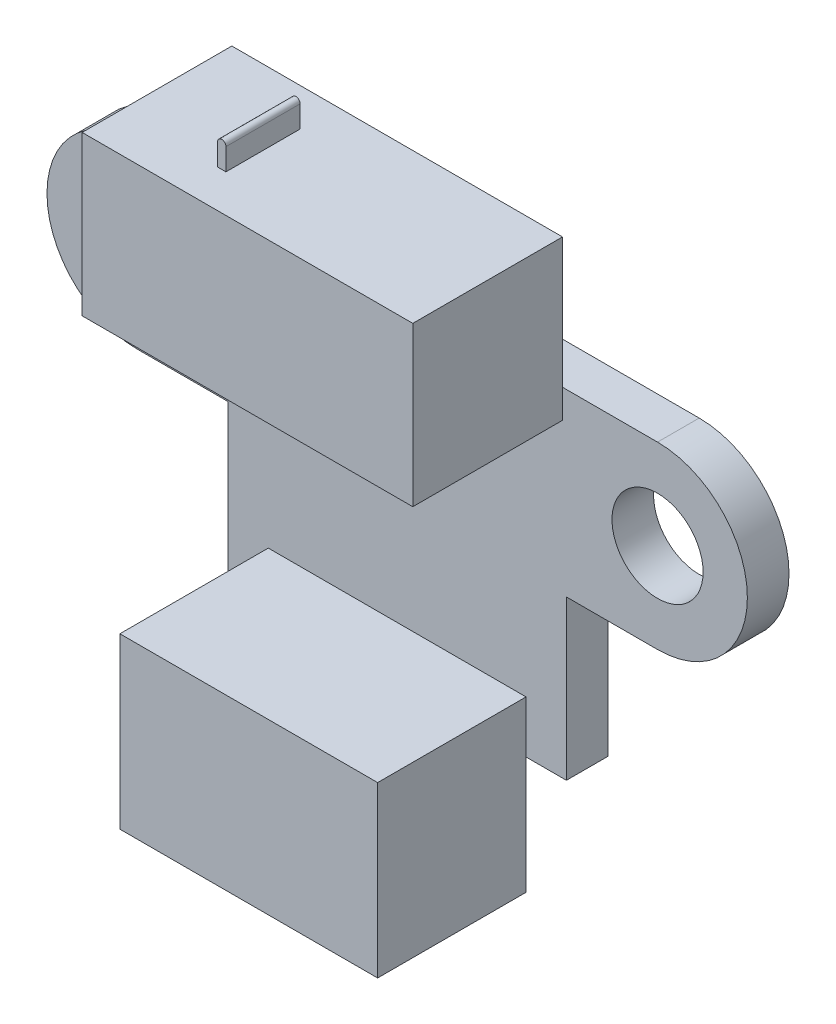
ISO-10303-21;
HEADER;
FILE_DESCRIPTION(('STEP AP214'),'2;1');
FILE_NAME('part.step','',(''),(''),'','','');
FILE_SCHEMA(('AUTOMOTIVE_DESIGN { 1 0 10303 214 1 1 1 1 }'));
ENDSEC;
DATA;
#1=APPLICATION_CONTEXT('core data for automotive mechanical design processes');
#2=APPLICATION_PROTOCOL_DEFINITION('international standard','automotive_design',2000,#1);
#3=PRODUCT_CONTEXT('',#1,'mechanical');
#4=PRODUCT('Part','Part','',(#3));
#5=PRODUCT_RELATED_PRODUCT_CATEGORY('part','',(#4));
#6=PRODUCT_DEFINITION_FORMATION('','',#4);
#7=PRODUCT_DEFINITION_CONTEXT('part definition',#1,'design');
#8=PRODUCT_DEFINITION('design','',#6,#7);
#9=PRODUCT_DEFINITION_SHAPE('','',#8);
#10=(LENGTH_UNIT() NAMED_UNIT(*) SI_UNIT(.MILLI.,.METRE.));
#11=(NAMED_UNIT(*) PLANE_ANGLE_UNIT() SI_UNIT($,.RADIAN.));
#12=(NAMED_UNIT(*) SI_UNIT($,.STERADIAN.) SOLID_ANGLE_UNIT());
#13=UNCERTAINTY_MEASURE_WITH_UNIT(LENGTH_MEASURE(1.E-05),#10,'distance_accuracy_value','');
#14=(GEOMETRIC_REPRESENTATION_CONTEXT(3) GLOBAL_UNCERTAINTY_ASSIGNED_CONTEXT((#13)) GLOBAL_UNIT_ASSIGNED_CONTEXT((#10,
#11,#12)) REPRESENTATION_CONTEXT('',''));
#15=CARTESIAN_POINT('',(0.,0.,0.));
#16=DIRECTION('',(0.,0.,1.));
#17=DIRECTION('',(1.,0.,0.));
#18=AXIS2_PLACEMENT_3D('',#15,#16,#17);
#19=CARTESIAN_POINT('',(-3.5,-3.45,1.6));
#20=DIRECTION('',(0.,0.,1.));
#21=DIRECTION('',(1.,0.,0.));
#22=AXIS2_PLACEMENT_3D('',#19,#20,#21);
#23=PLANE('',#22);
#24=CARTESIAN_POINT('',(-3.5,-3.45,1.6));
#25=DIRECTION('',(0.,0.,1.));
#26=DIRECTION('',(1.,0.,0.));
#27=AXIS2_PLACEMENT_3D('',#24,#25,#26);
#28=CIRCLE('',#27,1.75);
#29=CARTESIAN_POINT('',(-1.75,-3.45,1.6));
#30=VERTEX_POINT('',#29);
#31=EDGE_CURVE('E275',#30,#30,#28,.T.);
#32=ORIENTED_EDGE('',*,*,#31,.F.);
#33=EDGE_LOOP('',(#32));
#34=FACE_BOUND('',#33,.T.);
#35=CARTESIAN_POINT('',(16.5,-3.45,1.6));
#36=DIRECTION('',(0.,0.,1.));
#37=DIRECTION('',(1.,0.,0.));
#38=AXIS2_PLACEMENT_3D('',#35,#36,#37);
#39=CIRCLE('',#38,1.75);
#40=CARTESIAN_POINT('',(18.25,-3.45,1.6));
#41=VERTEX_POINT('',#40);
#42=EDGE_CURVE('E274',#41,#41,#39,.T.);
#43=ORIENTED_EDGE('',*,*,#42,.F.);
#44=EDGE_LOOP('',(#43));
#45=FACE_BOUND('',#44,.T.);
#46=DIRECTION('',(1.,0.,0.));
#47=VECTOR('',#46,1.);
#48=CARTESIAN_POINT('',(0.150000000000001,-1.1,1.6));
#49=LINE('',#48,#47);
#50=CARTESIAN_POINT('',(0.150000000000001,-1.1,1.6));
#51=VERTEX_POINT('',#50);
#52=CARTESIAN_POINT('',(12.85,-1.1,1.6));
#53=VERTEX_POINT('',#52);
#54=EDGE_CURVE('E262',#51,#53,#49,.T.);
#55=ORIENTED_EDGE('',*,*,#54,.F.);
#56=DIRECTION('',(0.,1.,0.));
#57=VECTOR('',#56,1.);
#58=CARTESIAN_POINT('',(0.150000000000001,-3.45,1.6));
#59=LINE('',#58,#57);
#60=CARTESIAN_POINT('',(0.150000000000001,0.,1.6));
#61=VERTEX_POINT('',#60);
#62=EDGE_CURVE('E415',#51,#61,#59,.T.);
#63=ORIENTED_EDGE('',*,*,#62,.T.);
#64=DIRECTION('',(-1.,0.,0.));
#65=VECTOR('',#64,1.);
#66=CARTESIAN_POINT('',(0.,0.,1.6));
#67=LINE('',#66,#65);
#68=CARTESIAN_POINT('',(-3.5,0.,1.6));
#69=VERTEX_POINT('',#68);
#70=EDGE_CURVE('E354',#61,#69,#67,.T.);
#71=ORIENTED_EDGE('',*,*,#70,.T.);
#72=CARTESIAN_POINT('',(-3.5,-3.45,1.6));
#73=DIRECTION('',(0.,0.,1.));
#74=DIRECTION('',(1.,0.,0.));
#75=AXIS2_PLACEMENT_3D('',#72,#73,#74);
#76=CIRCLE('',#75,3.45);
#77=CARTESIAN_POINT('',(-3.5,-6.9,1.6));
#78=VERTEX_POINT('',#77);
#79=EDGE_CURVE('E352',#69,#78,#76,.T.);
#80=ORIENTED_EDGE('',*,*,#79,.T.);
#81=DIRECTION('',(1.,0.,0.));
#82=VECTOR('',#81,1.);
#83=CARTESIAN_POINT('',(-3.5,-6.9,1.6));
#84=LINE('',#83,#82);
#85=CARTESIAN_POINT('',(0.,-6.9,1.6));
#86=VERTEX_POINT('',#85);
#87=EDGE_CURVE('E356',#78,#86,#84,.T.);
#88=ORIENTED_EDGE('',*,*,#87,.T.);
#89=DIRECTION('',(0.,-1.,0.));
#90=VECTOR('',#89,1.);
#91=CARTESIAN_POINT('',(0.,-6.9,1.6));
#92=LINE('',#91,#90);
#93=CARTESIAN_POINT('',(0.,-13.,1.6));
#94=VERTEX_POINT('',#93);
#95=EDGE_CURVE('E358',#86,#94,#92,.T.);
#96=ORIENTED_EDGE('',*,*,#95,.T.);
#97=DIRECTION('',(1.,0.,0.));
#98=VECTOR('',#97,1.);
#99=CARTESIAN_POINT('',(0.,-13.,1.6));
#100=LINE('',#99,#98);
#101=CARTESIAN_POINT('',(1.55,-13.,1.6));
#102=VERTEX_POINT('',#101);
#103=EDGE_CURVE('E361',#94,#102,#100,.T.);
#104=ORIENTED_EDGE('',*,*,#103,.T.);
#105=DIRECTION('',(0.,-1.,0.));
#106=VECTOR('',#105,1.);
#107=CARTESIAN_POINT('',(1.55,-11.,1.6));
#108=LINE('',#107,#106);
#109=CARTESIAN_POINT('',(1.55,-11.,1.6));
#110=VERTEX_POINT('',#109);
#111=EDGE_CURVE('E329',#110,#102,#108,.T.);
#112=ORIENTED_EDGE('',*,*,#111,.F.);
#113=DIRECTION('',(-1.,0.,0.));
#114=VECTOR('',#113,1.);
#115=CARTESIAN_POINT('',(11.45,-11.,1.6));
#116=LINE('',#115,#114);
#117=CARTESIAN_POINT('',(11.45,-11.,1.6));
#118=VERTEX_POINT('',#117);
#119=EDGE_CURVE('E308',#118,#110,#116,.T.);
#120=ORIENTED_EDGE('',*,*,#119,.F.);
#121=DIRECTION('',(0.,1.,0.));
#122=VECTOR('',#121,1.);
#123=CARTESIAN_POINT('',(11.45,-17.5,1.6));
#124=LINE('',#123,#122);
#125=CARTESIAN_POINT('',(11.45,-13.,1.6));
#126=VERTEX_POINT('',#125);
#127=EDGE_CURVE('E336',#126,#118,#124,.T.);
#128=ORIENTED_EDGE('',*,*,#127,.F.);
#129=CARTESIAN_POINT('',(13.,-13.,1.6));
#130=VERTEX_POINT('',#129);
#131=EDGE_CURVE('E360',#126,#130,#100,.T.);
#132=ORIENTED_EDGE('',*,*,#131,.T.);
#133=DIRECTION('',(0.,1.,0.));
#134=VECTOR('',#133,1.);
#135=CARTESIAN_POINT('',(13.,-13.,1.6));
#136=LINE('',#135,#134);
#137=CARTESIAN_POINT('',(13.,-6.9,1.6));
#138=VERTEX_POINT('',#137);
#139=EDGE_CURVE('E363',#130,#138,#136,.T.);
#140=ORIENTED_EDGE('',*,*,#139,.T.);
#141=DIRECTION('',(1.,0.,0.));
#142=VECTOR('',#141,1.);
#143=CARTESIAN_POINT('',(16.5,-6.9,1.6));
#144=LINE('',#143,#142);
#145=CARTESIAN_POINT('',(16.5,-6.9,1.6));
#146=VERTEX_POINT('',#145);
#147=EDGE_CURVE('E366',#138,#146,#144,.T.);
#148=ORIENTED_EDGE('',*,*,#147,.T.);
#149=CARTESIAN_POINT('',(16.5,-3.45,1.6));
#150=DIRECTION('',(0.,0.,1.));
#151=DIRECTION('',(-1.,0.,0.));
#152=AXIS2_PLACEMENT_3D('',#149,#150,#151);
#153=CIRCLE('',#152,3.45);
#154=CARTESIAN_POINT('',(16.5,0.,1.6));
#155=VERTEX_POINT('',#154);
#156=EDGE_CURVE('E368',#146,#155,#153,.T.);
#157=ORIENTED_EDGE('',*,*,#156,.T.);
#158=CARTESIAN_POINT('',(12.85,0.,1.6));
#159=VERTEX_POINT('',#158);
#160=EDGE_CURVE('E349',#155,#159,#67,.T.);
#161=ORIENTED_EDGE('',*,*,#160,.T.);
#162=DIRECTION('',(0.,1.,0.));
#163=VECTOR('',#162,1.);
#164=CARTESIAN_POINT('',(12.85,-1.1,1.6));
#165=LINE('',#164,#163);
#166=EDGE_CURVE('E253',#53,#159,#165,.T.);
#167=ORIENTED_EDGE('',*,*,#166,.F.);
#168=EDGE_LOOP('',(#55,#63,#71,#80,#88,#96,#104,#112,#120,#128,#132,#140,#148,#157,#161,#167));
#169=FACE_BOUND('',#168,.T.);
#170=ADVANCED_FACE('F38',(#34,#45,#169),#23,.T.);
#171=CARTESIAN_POINT('',(-3.5,-3.45,1.6));
#172=DIRECTION('',(0.,0.,-1.));
#173=DIRECTION('',(-1.,0.,0.));
#174=AXIS2_PLACEMENT_3D('',#171,#172,#173);
#175=CYLINDRICAL_SURFACE('',#174,3.45);
#176=CARTESIAN_POINT('',(-3.5,-3.45,0.));
#177=DIRECTION('',(0.,0.,1.));
#178=DIRECTION('',(1.,0.,0.));
#179=AXIS2_PLACEMENT_3D('',#176,#177,#178);
#180=CIRCLE('',#179,3.45);
#181=CARTESIAN_POINT('',(-3.5,0.,0.));
#182=VERTEX_POINT('',#181);
#183=CARTESIAN_POINT('',(-3.5,-6.9,0.));
#184=VERTEX_POINT('',#183);
#185=EDGE_CURVE('E348',#182,#184,#180,.T.);
#186=ORIENTED_EDGE('',*,*,#185,.T.);
#187=DIRECTION('',(0.,0.,-1.));
#188=VECTOR('',#187,1.);
#189=CARTESIAN_POINT('',(-3.5,-6.9,1.6));
#190=LINE('',#189,#188);
#191=EDGE_CURVE('E405',#78,#184,#190,.T.);
#192=ORIENTED_EDGE('',*,*,#191,.F.);
#193=ORIENTED_EDGE('',*,*,#79,.F.);
#194=DIRECTION('',(0.,0.,-1.));
#195=VECTOR('',#194,1.);
#196=CARTESIAN_POINT('',(-3.5,0.,1.6));
#197=LINE('',#196,#195);
#198=EDGE_CURVE('E408',#69,#182,#197,.T.);
#199=ORIENTED_EDGE('',*,*,#198,.T.);
#200=EDGE_LOOP('',(#186,#192,#193,#199));
#201=FACE_BOUND('',#200,.T.);
#202=ADVANCED_FACE('F40',(#201),#175,.T.);
#203=CARTESIAN_POINT('',(-3.5,-6.9,1.6));
#204=DIRECTION('',(0.,1.,0.));
#205=DIRECTION('',(-1.,0.,0.));
#206=AXIS2_PLACEMENT_3D('',#203,#204,#205);
#207=PLANE('',#206);
#208=DIRECTION('',(1.,0.,0.));
#209=VECTOR('',#208,1.);
#210=CARTESIAN_POINT('',(-3.5,-6.9,0.));
#211=LINE('',#210,#209);
#212=CARTESIAN_POINT('',(0.,-6.9,0.));
#213=VERTEX_POINT('',#212);
#214=EDGE_CURVE('E373',#184,#213,#211,.T.);
#215=ORIENTED_EDGE('',*,*,#214,.T.);
#216=DIRECTION('',(0.,0.,-1.));
#217=VECTOR('',#216,1.);
#218=CARTESIAN_POINT('',(0.,-6.9,1.6));
#219=LINE('',#218,#217);
#220=EDGE_CURVE('E402',#86,#213,#219,.T.);
#221=ORIENTED_EDGE('',*,*,#220,.F.);
#222=ORIENTED_EDGE('',*,*,#87,.F.);
#223=ORIENTED_EDGE('',*,*,#191,.T.);
#224=EDGE_LOOP('',(#215,#221,#222,#223));
#225=FACE_BOUND('',#224,.T.);
#226=ADVANCED_FACE('F437',(#225),#207,.F.);
#227=CARTESIAN_POINT('',(0.,-6.9,1.6));
#228=DIRECTION('',(1.,0.,0.));
#229=DIRECTION('',(0.,1.,0.));
#230=AXIS2_PLACEMENT_3D('',#227,#228,#229);
#231=PLANE('',#230);
#232=DIRECTION('',(0.,-1.,0.));
#233=VECTOR('',#232,1.);
#234=CARTESIAN_POINT('',(0.,-6.9,0.));
#235=LINE('',#234,#233);
#236=CARTESIAN_POINT('',(0.,-13.,0.));
#237=VERTEX_POINT('',#236);
#238=EDGE_CURVE('E375',#213,#237,#235,.T.);
#239=ORIENTED_EDGE('',*,*,#238,.T.);
#240=DIRECTION('',(0.,0.,-1.));
#241=VECTOR('',#240,1.);
#242=CARTESIAN_POINT('',(0.,-13.,1.6));
#243=LINE('',#242,#241);
#244=EDGE_CURVE('E399',#94,#237,#243,.T.);
#245=ORIENTED_EDGE('',*,*,#244,.F.);
#246=ORIENTED_EDGE('',*,*,#95,.F.);
#247=ORIENTED_EDGE('',*,*,#220,.T.);
#248=EDGE_LOOP('',(#239,#245,#246,#247));
#249=FACE_BOUND('',#248,.T.);
#250=ADVANCED_FACE('F469',(#249),#231,.F.);
#251=CARTESIAN_POINT('',(0.,-13.,1.6));
#252=DIRECTION('',(0.,1.,0.));
#253=DIRECTION('',(-1.,0.,0.));
#254=AXIS2_PLACEMENT_3D('',#251,#252,#253);
#255=PLANE('',#254);
#256=DIRECTION('',(1.,0.,0.));
#257=VECTOR('',#256,1.);
#258=CARTESIAN_POINT('',(0.,-13.,0.));
#259=LINE('',#258,#257);
#260=CARTESIAN_POINT('',(13.,-13.,0.));
#261=VERTEX_POINT('',#260);
#262=EDGE_CURVE('E377',#237,#261,#259,.T.);
#263=ORIENTED_EDGE('',*,*,#262,.T.);
#264=DIRECTION('',(0.,0.,-1.));
#265=VECTOR('',#264,1.);
#266=CARTESIAN_POINT('',(13.,-13.,1.6));
#267=LINE('',#266,#265);
#268=EDGE_CURVE('E396',#130,#261,#267,.T.);
#269=ORIENTED_EDGE('',*,*,#268,.F.);
#270=ORIENTED_EDGE('',*,*,#131,.F.);
#271=EDGE_CURVE('E364',#102,#126,#100,.T.);
#272=ORIENTED_EDGE('',*,*,#271,.F.);
#273=ORIENTED_EDGE('',*,*,#103,.F.);
#274=ORIENTED_EDGE('',*,*,#244,.T.);
#275=EDGE_LOOP('',(#263,#269,#270,#272,#273,#274));
#276=FACE_BOUND('',#275,.T.);
#277=ADVANCED_FACE('F465',(#276),#255,.F.);
#278=CARTESIAN_POINT('',(13.,-13.,1.6));
#279=DIRECTION('',(-1.,0.,0.));
#280=DIRECTION('',(0.,0.,1.));
#281=AXIS2_PLACEMENT_3D('',#278,#279,#280);
#282=PLANE('',#281);
#283=DIRECTION('',(0.,1.,0.));
#284=VECTOR('',#283,1.);
#285=CARTESIAN_POINT('',(13.,-13.,0.));
#286=LINE('',#285,#284);
#287=CARTESIAN_POINT('',(13.,-6.9,0.));
#288=VERTEX_POINT('',#287);
#289=EDGE_CURVE('E379',#261,#288,#286,.T.);
#290=ORIENTED_EDGE('',*,*,#289,.T.);
#291=DIRECTION('',(0.,0.,-1.));
#292=VECTOR('',#291,1.);
#293=CARTESIAN_POINT('',(13.,-6.9,1.6));
#294=LINE('',#293,#292);
#295=EDGE_CURVE('E393',#138,#288,#294,.T.);
#296=ORIENTED_EDGE('',*,*,#295,.F.);
#297=ORIENTED_EDGE('',*,*,#139,.F.);
#298=ORIENTED_EDGE('',*,*,#268,.T.);
#299=EDGE_LOOP('',(#290,#296,#297,#298));
#300=FACE_BOUND('',#299,.T.);
#301=ADVANCED_FACE('F461',(#300),#282,.F.);
#302=CARTESIAN_POINT('',(16.5,-6.9,1.6));
#303=DIRECTION('',(0.,1.,0.));
#304=DIRECTION('',(0.,0.,1.));
#305=AXIS2_PLACEMENT_3D('',#302,#303,#304);
#306=PLANE('',#305);
#307=DIRECTION('',(1.,0.,0.));
#308=VECTOR('',#307,1.);
#309=CARTESIAN_POINT('',(16.5,-6.9,0.));
#310=LINE('',#309,#308);
#311=CARTESIAN_POINT('',(16.5,-6.9,0.));
#312=VERTEX_POINT('',#311);
#313=EDGE_CURVE('E381',#288,#312,#310,.T.);
#314=ORIENTED_EDGE('',*,*,#313,.T.);
#315=DIRECTION('',(0.,0.,-1.));
#316=VECTOR('',#315,1.);
#317=CARTESIAN_POINT('',(16.5,-6.9,1.6));
#318=LINE('',#317,#316);
#319=EDGE_CURVE('E390',#146,#312,#318,.T.);
#320=ORIENTED_EDGE('',*,*,#319,.F.);
#321=ORIENTED_EDGE('',*,*,#147,.F.);
#322=ORIENTED_EDGE('',*,*,#295,.T.);
#323=EDGE_LOOP('',(#314,#320,#321,#322));
#324=FACE_BOUND('',#323,.T.);
#325=ADVANCED_FACE('F457',(#324),#306,.F.);
#326=CARTESIAN_POINT('',(16.5,-3.45,1.6));
#327=DIRECTION('',(0.,0.,-1.));
#328=DIRECTION('',(-1.,0.,0.));
#329=AXIS2_PLACEMENT_3D('',#326,#327,#328);
#330=CYLINDRICAL_SURFACE('',#329,3.45);
#331=CARTESIAN_POINT('',(16.5,-3.45,0.));
#332=DIRECTION('',(0.,0.,1.));
#333=DIRECTION('',(-1.,0.,0.));
#334=AXIS2_PLACEMENT_3D('',#331,#332,#333);
#335=CIRCLE('',#334,3.45);
#336=CARTESIAN_POINT('',(16.5,0.,0.));
#337=VERTEX_POINT('',#336);
#338=EDGE_CURVE('E383',#312,#337,#335,.T.);
#339=ORIENTED_EDGE('',*,*,#338,.T.);
#340=DIRECTION('',(0.,0.,-1.));
#341=VECTOR('',#340,1.);
#342=CARTESIAN_POINT('',(16.5,0.,1.6));
#343=LINE('',#342,#341);
#344=EDGE_CURVE('E371',#155,#337,#343,.T.);
#345=ORIENTED_EDGE('',*,*,#344,.F.);
#346=ORIENTED_EDGE('',*,*,#156,.F.);
#347=ORIENTED_EDGE('',*,*,#319,.T.);
#348=EDGE_LOOP('',(#339,#345,#346,#347));
#349=FACE_BOUND('',#348,.T.);
#350=ADVANCED_FACE('F453',(#349),#330,.T.);
#351=CARTESIAN_POINT('',(13.,0.,1.6));
#352=DIRECTION('',(0.,-1.,0.));
#353=DIRECTION('',(1.,0.,0.));
#354=AXIS2_PLACEMENT_3D('',#351,#352,#353);
#355=PLANE('',#354);
#356=DIRECTION('',(-1.,0.,0.));
#357=VECTOR('',#356,1.);
#358=CARTESIAN_POINT('',(13.,0.,0.));
#359=LINE('',#358,#357);
#360=EDGE_CURVE('E386',#337,#182,#359,.T.);
#361=ORIENTED_EDGE('',*,*,#360,.T.);
#362=ORIENTED_EDGE('',*,*,#198,.F.);
#363=ORIENTED_EDGE('',*,*,#70,.F.);
#364=EDGE_CURVE('E353',#159,#61,#67,.T.);
#365=ORIENTED_EDGE('',*,*,#364,.F.);
#366=ORIENTED_EDGE('',*,*,#160,.F.);
#367=ORIENTED_EDGE('',*,*,#344,.T.);
#368=EDGE_LOOP('',(#361,#362,#363,#365,#366,#367));
#369=FACE_BOUND('',#368,.T.);
#370=ADVANCED_FACE('F449',(#369),#355,.F.);
#371=CARTESIAN_POINT('',(-3.5,-3.45,0.));
#372=DIRECTION('',(0.,0.,1.));
#373=DIRECTION('',(1.,0.,0.));
#374=AXIS2_PLACEMENT_3D('',#371,#372,#373);
#375=PLANE('',#374);
#376=CARTESIAN_POINT('',(-3.5,-3.45,0.));
#377=DIRECTION('',(0.,0.,1.));
#378=DIRECTION('',(1.,0.,0.));
#379=AXIS2_PLACEMENT_3D('',#376,#377,#378);
#380=CIRCLE('',#379,1.75);
#381=CARTESIAN_POINT('',(-1.75,-3.45,0.));
#382=VERTEX_POINT('',#381);
#383=EDGE_CURVE('E298',#382,#382,#380,.T.);
#384=ORIENTED_EDGE('',*,*,#383,.T.);
#385=EDGE_LOOP('',(#384));
#386=FACE_BOUND('',#385,.T.);
#387=CARTESIAN_POINT('',(16.5,-3.45,0.));
#388=DIRECTION('',(0.,0.,1.));
#389=DIRECTION('',(1.,0.,0.));
#390=AXIS2_PLACEMENT_3D('',#387,#388,#389);
#391=CIRCLE('',#390,1.75);
#392=CARTESIAN_POINT('',(18.25,-3.45,0.));
#393=VERTEX_POINT('',#392);
#394=EDGE_CURVE('E278',#393,#393,#391,.T.);
#395=ORIENTED_EDGE('',*,*,#394,.T.);
#396=EDGE_LOOP('',(#395));
#397=FACE_BOUND('',#396,.T.);
#398=ORIENTED_EDGE('',*,*,#185,.F.);
#399=ORIENTED_EDGE('',*,*,#360,.F.);
#400=ORIENTED_EDGE('',*,*,#338,.F.);
#401=ORIENTED_EDGE('',*,*,#313,.F.);
#402=ORIENTED_EDGE('',*,*,#289,.F.);
#403=ORIENTED_EDGE('',*,*,#262,.F.);
#404=ORIENTED_EDGE('',*,*,#238,.F.);
#405=ORIENTED_EDGE('',*,*,#214,.F.);
#406=EDGE_LOOP('',(#398,#399,#400,#401,#402,#403,#404,#405));
#407=FACE_BOUND('',#406,.T.);
#408=ADVANCED_FACE('F445',(#386,#397,#407),#375,.F.);
#409=CARTESIAN_POINT('',(0.,0.,1.6));
#410=DIRECTION('',(0.,0.,1.));
#411=DIRECTION('',(1.,0.,0.));
#412=AXIS2_PLACEMENT_3D('',#409,#410,#411);
#413=PLANE('',#412);
#414=CARTESIAN_POINT('',(1.55,-17.5,1.6));
#415=VERTEX_POINT('',#414);
#416=EDGE_CURVE('E328',#102,#415,#108,.T.);
#417=ORIENTED_EDGE('',*,*,#416,.F.);
#418=ORIENTED_EDGE('',*,*,#271,.T.);
#419=CARTESIAN_POINT('',(11.45,-17.5,1.6));
#420=VERTEX_POINT('',#419);
#421=EDGE_CURVE('E319',#420,#126,#124,.T.);
#422=ORIENTED_EDGE('',*,*,#421,.F.);
#423=DIRECTION('',(1.,0.,0.));
#424=VECTOR('',#423,1.);
#425=CARTESIAN_POINT('',(1.55,-17.5,1.6));
#426=LINE('',#425,#424);
#427=EDGE_CURVE('E332',#415,#420,#426,.T.);
#428=ORIENTED_EDGE('',*,*,#427,.F.);
#429=EDGE_LOOP('',(#417,#418,#422,#428));
#430=FACE_BOUND('',#429,.T.);
#431=ADVANCED_FACE('F448',(#430),#413,.F.);
#432=CARTESIAN_POINT('',(11.45,-11.,7.3));
#433=DIRECTION('',(0.,-1.,0.));
#434=DIRECTION('',(1.,0.,0.));
#435=AXIS2_PLACEMENT_3D('',#432,#433,#434);
#436=PLANE('',#435);
#437=ORIENTED_EDGE('',*,*,#119,.T.);
#438=DIRECTION('',(0.,0.,-1.));
#439=VECTOR('',#438,1.);
#440=CARTESIAN_POINT('',(1.55,-11.,7.3));
#441=LINE('',#440,#439);
#442=CARTESIAN_POINT('',(1.55,-11.,7.3));
#443=VERTEX_POINT('',#442);
#444=EDGE_CURVE('E345',#443,#110,#441,.T.);
#445=ORIENTED_EDGE('',*,*,#444,.F.);
#446=DIRECTION('',(-1.,0.,0.));
#447=VECTOR('',#446,1.);
#448=CARTESIAN_POINT('',(11.45,-11.,7.3));
#449=LINE('',#448,#447);
#450=CARTESIAN_POINT('',(11.45,-11.,7.3));
#451=VERTEX_POINT('',#450);
#452=EDGE_CURVE('E315',#451,#443,#449,.T.);
#453=ORIENTED_EDGE('',*,*,#452,.F.);
#454=DIRECTION('',(0.,0.,-1.));
#455=VECTOR('',#454,1.);
#456=CARTESIAN_POINT('',(11.45,-11.,7.3));
#457=LINE('',#456,#455);
#458=EDGE_CURVE('E325',#451,#118,#457,.T.);
#459=ORIENTED_EDGE('',*,*,#458,.T.);
#460=EDGE_LOOP('',(#437,#445,#453,#459));
#461=FACE_BOUND('',#460,.T.);
#462=ADVANCED_FACE('F443',(#461),#436,.F.);
#463=CARTESIAN_POINT('',(1.55,-11.,7.3));
#464=DIRECTION('',(1.,0.,0.));
#465=DIRECTION('',(0.,1.,0.));
#466=AXIS2_PLACEMENT_3D('',#463,#464,#465);
#467=PLANE('',#466);
#468=ORIENTED_EDGE('',*,*,#111,.T.);
#469=ORIENTED_EDGE('',*,*,#416,.T.);
#470=DIRECTION('',(0.,0.,-1.));
#471=VECTOR('',#470,1.);
#472=CARTESIAN_POINT('',(1.55,-17.5,7.3));
#473=LINE('',#472,#471);
#474=CARTESIAN_POINT('',(1.55,-17.5,7.3));
#475=VERTEX_POINT('',#474);
#476=EDGE_CURVE('E342',#475,#415,#473,.T.);
#477=ORIENTED_EDGE('',*,*,#476,.F.);
#478=DIRECTION('',(0.,-1.,0.));
#479=VECTOR('',#478,1.);
#480=CARTESIAN_POINT('',(1.55,-11.,7.3));
#481=LINE('',#480,#479);
#482=EDGE_CURVE('E318',#443,#475,#481,.T.);
#483=ORIENTED_EDGE('',*,*,#482,.F.);
#484=ORIENTED_EDGE('',*,*,#444,.T.);
#485=EDGE_LOOP('',(#468,#469,#477,#483,#484));
#486=FACE_BOUND('',#485,.T.);
#487=ADVANCED_FACE('F515',(#486),#467,.F.);
#488=CARTESIAN_POINT('',(1.55,-17.5,7.3));
#489=DIRECTION('',(0.,1.,0.));
#490=DIRECTION('',(0.,0.,1.));
#491=AXIS2_PLACEMENT_3D('',#488,#489,#490);
#492=PLANE('',#491);
#493=DIRECTION('',(1.,0.,0.));
#494=VECTOR('',#493,1.);
#495=CARTESIAN_POINT('',(10.7,-17.5,2.35));
#496=LINE('',#495,#494);
#497=CARTESIAN_POINT('',(2.3,-17.5,2.35));
#498=VERTEX_POINT('',#497);
#499=CARTESIAN_POINT('',(10.7,-17.5,2.35));
#500=VERTEX_POINT('',#499);
#501=EDGE_CURVE('E297',#498,#500,#496,.T.);
#502=ORIENTED_EDGE('',*,*,#501,.F.);
#503=DIRECTION('',(0.,0.,-1.));
#504=VECTOR('',#503,1.);
#505=CARTESIAN_POINT('',(2.3,-17.5,2.35));
#506=LINE('',#505,#504);
#507=CARTESIAN_POINT('',(2.3,-17.5,6.55));
#508=VERTEX_POINT('',#507);
#509=EDGE_CURVE('E295',#508,#498,#506,.T.);
#510=ORIENTED_EDGE('',*,*,#509,.F.);
#511=DIRECTION('',(-1.,0.,0.));
#512=VECTOR('',#511,1.);
#513=CARTESIAN_POINT('',(2.3,-17.5,6.55));
#514=LINE('',#513,#512);
#515=CARTESIAN_POINT('',(10.7,-17.5,6.55));
#516=VERTEX_POINT('',#515);
#517=EDGE_CURVE('E285',#516,#508,#514,.T.);
#518=ORIENTED_EDGE('',*,*,#517,.F.);
#519=DIRECTION('',(0.,0.,1.));
#520=VECTOR('',#519,1.);
#521=CARTESIAN_POINT('',(10.7,-17.5,6.55));
#522=LINE('',#521,#520);
#523=EDGE_CURVE('E301',#500,#516,#522,.T.);
#524=ORIENTED_EDGE('',*,*,#523,.F.);
#525=EDGE_LOOP('',(#502,#510,#518,#524));
#526=FACE_BOUND('',#525,.T.);
#527=ORIENTED_EDGE('',*,*,#427,.T.);
#528=DIRECTION('',(0.,0.,-1.));
#529=VECTOR('',#528,1.);
#530=CARTESIAN_POINT('',(11.45,-17.5,7.3));
#531=LINE('',#530,#529);
#532=CARTESIAN_POINT('',(11.45,-17.5,7.3));
#533=VERTEX_POINT('',#532);
#534=EDGE_CURVE('E339',#533,#420,#531,.T.);
#535=ORIENTED_EDGE('',*,*,#534,.F.);
#536=DIRECTION('',(1.,0.,0.));
#537=VECTOR('',#536,1.);
#538=CARTESIAN_POINT('',(1.55,-17.5,7.3));
#539=LINE('',#538,#537);
#540=EDGE_CURVE('E321',#475,#533,#539,.T.);
#541=ORIENTED_EDGE('',*,*,#540,.F.);
#542=ORIENTED_EDGE('',*,*,#476,.T.);
#543=EDGE_LOOP('',(#527,#535,#541,#542));
#544=FACE_BOUND('',#543,.T.);
#545=ADVANCED_FACE('F512',(#526,#544),#492,.F.);
#546=CARTESIAN_POINT('',(11.45,-17.5,7.3));
#547=DIRECTION('',(-1.,0.,0.));
#548=DIRECTION('',(0.,0.,1.));
#549=AXIS2_PLACEMENT_3D('',#546,#547,#548);
#550=PLANE('',#549);
#551=ORIENTED_EDGE('',*,*,#421,.T.);
#552=ORIENTED_EDGE('',*,*,#127,.T.);
#553=ORIENTED_EDGE('',*,*,#458,.F.);
#554=DIRECTION('',(0.,1.,0.));
#555=VECTOR('',#554,1.);
#556=CARTESIAN_POINT('',(11.45,-17.5,7.3));
#557=LINE('',#556,#555);
#558=EDGE_CURVE('E323',#533,#451,#557,.T.);
#559=ORIENTED_EDGE('',*,*,#558,.F.);
#560=ORIENTED_EDGE('',*,*,#534,.T.);
#561=EDGE_LOOP('',(#551,#552,#553,#559,#560));
#562=FACE_BOUND('',#561,.T.);
#563=ADVANCED_FACE('F506',(#562),#550,.F.);
#564=CARTESIAN_POINT('',(0.,0.,7.3));
#565=DIRECTION('',(0.,0.,1.));
#566=DIRECTION('',(1.,0.,0.));
#567=AXIS2_PLACEMENT_3D('',#564,#565,#566);
#568=PLANE('',#567);
#569=ORIENTED_EDGE('',*,*,#452,.T.);
#570=ORIENTED_EDGE('',*,*,#482,.T.);
#571=ORIENTED_EDGE('',*,*,#540,.T.);
#572=ORIENTED_EDGE('',*,*,#558,.T.);
#573=EDGE_LOOP('',(#569,#570,#571,#572));
#574=FACE_BOUND('',#573,.T.);
#575=ADVANCED_FACE('F582',(#574),#568,.T.);
#576=CARTESIAN_POINT('',(2.3,-11.75,2.35));
#577=DIRECTION('',(-1.,0.,0.));
#578=DIRECTION('',(0.,0.,1.));
#579=AXIS2_PLACEMENT_3D('',#576,#577,#578);
#580=PLANE('',#579);
#581=ORIENTED_EDGE('',*,*,#509,.T.);
#582=DIRECTION('',(0.,-1.,0.));
#583=VECTOR('',#582,1.);
#584=CARTESIAN_POINT('',(2.3,-11.75,2.35));
#585=LINE('',#584,#583);
#586=CARTESIAN_POINT('',(2.3,-11.75,2.35));
#587=VERTEX_POINT('',#586);
#588=EDGE_CURVE('E294',#587,#498,#585,.T.);
#589=ORIENTED_EDGE('',*,*,#588,.F.);
#590=DIRECTION('',(0.,0.,-1.));
#591=VECTOR('',#590,1.);
#592=CARTESIAN_POINT('',(2.3,-11.75,2.35));
#593=LINE('',#592,#591);
#594=CARTESIAN_POINT('',(2.3,-11.75,6.55));
#595=VERTEX_POINT('',#594);
#596=EDGE_CURVE('E281',#595,#587,#593,.T.);
#597=ORIENTED_EDGE('',*,*,#596,.F.);
#598=DIRECTION('',(0.,-1.,0.));
#599=VECTOR('',#598,1.);
#600=CARTESIAN_POINT('',(2.3,-11.75,6.55));
#601=LINE('',#600,#599);
#602=EDGE_CURVE('E306',#595,#508,#601,.T.);
#603=ORIENTED_EDGE('',*,*,#602,.T.);
#604=EDGE_LOOP('',(#581,#589,#597,#603));
#605=FACE_BOUND('',#604,.T.);
#606=ADVANCED_FACE('F572',(#605),#580,.F.);
#607=CARTESIAN_POINT('',(2.3,-11.75,6.55));
#608=DIRECTION('',(0.,0.,1.));
#609=DIRECTION('',(1.,0.,0.));
#610=AXIS2_PLACEMENT_3D('',#607,#608,#609);
#611=PLANE('',#610);
#612=ORIENTED_EDGE('',*,*,#517,.T.);
#613=ORIENTED_EDGE('',*,*,#602,.F.);
#614=DIRECTION('',(-1.,0.,0.));
#615=VECTOR('',#614,1.);
#616=CARTESIAN_POINT('',(2.3,-11.75,6.55));
#617=LINE('',#616,#615);
#618=CARTESIAN_POINT('',(10.7,-11.75,6.55));
#619=VERTEX_POINT('',#618);
#620=EDGE_CURVE('E291',#619,#595,#617,.T.);
#621=ORIENTED_EDGE('',*,*,#620,.F.);
#622=DIRECTION('',(0.,-1.,0.));
#623=VECTOR('',#622,1.);
#624=CARTESIAN_POINT('',(10.7,-11.75,6.55));
#625=LINE('',#624,#623);
#626=EDGE_CURVE('E309',#619,#516,#625,.T.);
#627=ORIENTED_EDGE('',*,*,#626,.T.);
#628=EDGE_LOOP('',(#612,#613,#621,#627));
#629=FACE_BOUND('',#628,.T.);
#630=ADVANCED_FACE('F568',(#629),#611,.F.);
#631=CARTESIAN_POINT('',(10.7,-11.75,6.55));
#632=DIRECTION('',(1.,0.,0.));
#633=DIRECTION('',(0.,0.,-1.));
#634=AXIS2_PLACEMENT_3D('',#631,#632,#633);
#635=PLANE('',#634);
#636=ORIENTED_EDGE('',*,*,#523,.T.);
#637=ORIENTED_EDGE('',*,*,#626,.F.);
#638=DIRECTION('',(0.,0.,1.));
#639=VECTOR('',#638,1.);
#640=CARTESIAN_POINT('',(10.7,-11.75,6.55));
#641=LINE('',#640,#639);
#642=CARTESIAN_POINT('',(10.7,-11.75,2.35));
#643=VERTEX_POINT('',#642);
#644=EDGE_CURVE('E288',#643,#619,#641,.T.);
#645=ORIENTED_EDGE('',*,*,#644,.F.);
#646=DIRECTION('',(0.,-1.,0.));
#647=VECTOR('',#646,1.);
#648=CARTESIAN_POINT('',(10.7,-11.75,2.35));
#649=LINE('',#648,#647);
#650=EDGE_CURVE('E311',#643,#500,#649,.T.);
#651=ORIENTED_EDGE('',*,*,#650,.T.);
#652=EDGE_LOOP('',(#636,#637,#645,#651));
#653=FACE_BOUND('',#652,.T.);
#654=ADVANCED_FACE('F571',(#653),#635,.F.);
#655=CARTESIAN_POINT('',(10.7,-11.75,2.35));
#656=DIRECTION('',(0.,0.,-1.));
#657=DIRECTION('',(-1.,0.,0.));
#658=AXIS2_PLACEMENT_3D('',#655,#656,#657);
#659=PLANE('',#658);
#660=ORIENTED_EDGE('',*,*,#501,.T.);
#661=ORIENTED_EDGE('',*,*,#650,.F.);
#662=DIRECTION('',(1.,0.,0.));
#663=VECTOR('',#662,1.);
#664=CARTESIAN_POINT('',(10.7,-11.75,2.35));
#665=LINE('',#664,#663);
#666=EDGE_CURVE('E284',#587,#643,#665,.T.);
#667=ORIENTED_EDGE('',*,*,#666,.F.);
#668=ORIENTED_EDGE('',*,*,#588,.T.);
#669=EDGE_LOOP('',(#660,#661,#667,#668));
#670=FACE_BOUND('',#669,.T.);
#671=ADVANCED_FACE('F566',(#670),#659,.F.);
#672=CARTESIAN_POINT('',(0.,-11.75,0.));
#673=DIRECTION('',(0.,1.,0.));
#674=DIRECTION('',(0.,0.,1.));
#675=AXIS2_PLACEMENT_3D('',#672,#673,#674);
#676=PLANE('',#675);
#677=ORIENTED_EDGE('',*,*,#596,.T.);
#678=ORIENTED_EDGE('',*,*,#666,.T.);
#679=ORIENTED_EDGE('',*,*,#644,.T.);
#680=ORIENTED_EDGE('',*,*,#620,.T.);
#681=EDGE_LOOP('',(#677,#678,#679,#680));
#682=FACE_BOUND('',#681,.T.);
#683=ADVANCED_FACE('F562',(#682),#676,.F.);
#684=CARTESIAN_POINT('',(16.5,-3.45,-4.15));
#685=DIRECTION('',(0.,0.,1.));
#686=DIRECTION('',(1.,0.,0.));
#687=AXIS2_PLACEMENT_3D('',#684,#685,#686);
#688=CYLINDRICAL_SURFACE('',#687,1.75);
#689=ORIENTED_EDGE('',*,*,#42,.T.);
#690=EDGE_LOOP('',(#689));
#691=FACE_BOUND('',#690,.T.);
#692=ORIENTED_EDGE('',*,*,#394,.F.);
#693=EDGE_LOOP('',(#692));
#694=FACE_BOUND('',#693,.T.);
#695=ADVANCED_FACE('F558',(#691,#694),#688,.F.);
#696=CARTESIAN_POINT('',(-3.5,-3.45,-4.15));
#697=DIRECTION('',(0.,0.,1.));
#698=DIRECTION('',(1.,0.,0.));
#699=AXIS2_PLACEMENT_3D('',#696,#697,#698);
#700=CYLINDRICAL_SURFACE('',#699,1.75);
#701=ORIENTED_EDGE('',*,*,#31,.T.);
#702=EDGE_LOOP('',(#701));
#703=FACE_BOUND('',#702,.T.);
#704=ORIENTED_EDGE('',*,*,#383,.F.);
#705=EDGE_LOOP('',(#704));
#706=FACE_BOUND('',#705,.T.);
#707=ADVANCED_FACE('F555',(#703,#706),#700,.F.);
#708=CARTESIAN_POINT('',(0.,0.,1.6));
#709=DIRECTION('',(0.,0.,1.));
#710=DIRECTION('',(1.,0.,0.));
#711=AXIS2_PLACEMENT_3D('',#708,#709,#710);
#712=PLANE('',#711);
#713=DIRECTION('',(0.,-1.,0.));
#714=VECTOR('',#713,1.);
#715=CARTESIAN_POINT('',(0.150000000000001,5.,1.6));
#716=LINE('',#715,#714);
#717=CARTESIAN_POINT('',(0.150000000000001,5.,1.6));
#718=VERTEX_POINT('',#717);
#719=EDGE_CURVE('E240',#718,#61,#716,.T.);
#720=ORIENTED_EDGE('',*,*,#719,.F.);
#721=DIRECTION('',(-1.,0.,0.));
#722=VECTOR('',#721,1.);
#723=CARTESIAN_POINT('',(12.85,5.,1.6));
#724=LINE('',#723,#722);
#725=CARTESIAN_POINT('',(12.85,5.,1.6));
#726=VERTEX_POINT('',#725);
#727=EDGE_CURVE('E237',#726,#718,#724,.T.);
#728=ORIENTED_EDGE('',*,*,#727,.F.);
#729=EDGE_CURVE('E264',#159,#726,#165,.T.);
#730=ORIENTED_EDGE('',*,*,#729,.F.);
#731=ORIENTED_EDGE('',*,*,#364,.T.);
#732=EDGE_LOOP('',(#720,#728,#730,#731));
#733=FACE_BOUND('',#732,.T.);
#734=ADVANCED_FACE('F532',(#733),#712,.F.);
#735=CARTESIAN_POINT('',(12.85,5.,7.35));
#736=DIRECTION('',(0.,-1.,0.));
#737=DIRECTION('',(1.,0.,0.));
#738=AXIS2_PLACEMENT_3D('',#735,#736,#737);
#739=PLANE('',#738);
#740=DIRECTION('',(0.,0.,1.));
#741=VECTOR('',#740,1.);
#742=CARTESIAN_POINT('',(3.9,5.,1.6));
#743=LINE('',#742,#741);
#744=CARTESIAN_POINT('',(3.9,5.,3.05));
#745=VERTEX_POINT('',#744);
#746=CARTESIAN_POINT('',(3.9,5.,5.9));
#747=VERTEX_POINT('',#746);
#748=EDGE_CURVE('E229',#745,#747,#743,.T.);
#749=ORIENTED_EDGE('',*,*,#748,.F.);
#750=DIRECTION('',(1.,0.,0.));
#751=VECTOR('',#750,1.);
#752=CARTESIAN_POINT('',(2.85,5.,3.05));
#753=LINE('',#752,#751);
#754=CARTESIAN_POINT('',(4.22298273626066,5.,3.05));
#755=VERTEX_POINT('',#754);
#756=EDGE_CURVE('E232',#745,#755,#753,.T.);
#757=ORIENTED_EDGE('',*,*,#756,.T.);
#758=DIRECTION('',(0.,0.,1.));
#759=VECTOR('',#758,1.);
#760=CARTESIAN_POINT('',(4.22298273626066,5.,1.6));
#761=LINE('',#760,#759);
#762=CARTESIAN_POINT('',(4.22298273626066,5.,5.9));
#763=VERTEX_POINT('',#762);
#764=EDGE_CURVE('E231',#755,#763,#761,.T.);
#765=ORIENTED_EDGE('',*,*,#764,.T.);
#766=DIRECTION('',(1.,0.,0.));
#767=VECTOR('',#766,1.);
#768=CARTESIAN_POINT('',(2.85,5.,5.9));
#769=LINE('',#768,#767);
#770=EDGE_CURVE('E214',#747,#763,#769,.T.);
#771=ORIENTED_EDGE('',*,*,#770,.F.);
#772=EDGE_LOOP('',(#749,#757,#765,#771));
#773=FACE_BOUND('',#772,.T.);
#774=ORIENTED_EDGE('',*,*,#727,.T.);
#775=DIRECTION('',(0.,0.,-1.));
#776=VECTOR('',#775,1.);
#777=CARTESIAN_POINT('',(0.150000000000001,5.,7.35));
#778=LINE('',#777,#776);
#779=CARTESIAN_POINT('',(0.150000000000001,5.,7.35));
#780=VERTEX_POINT('',#779);
#781=EDGE_CURVE('E271',#780,#718,#778,.T.);
#782=ORIENTED_EDGE('',*,*,#781,.F.);
#783=DIRECTION('',(-1.,0.,0.));
#784=VECTOR('',#783,1.);
#785=CARTESIAN_POINT('',(12.85,5.,7.35));
#786=LINE('',#785,#784);
#787=CARTESIAN_POINT('',(12.85,5.,7.35));
#788=VERTEX_POINT('',#787);
#789=EDGE_CURVE('E250',#788,#780,#786,.T.);
#790=ORIENTED_EDGE('',*,*,#789,.F.);
#791=DIRECTION('',(0.,0.,-1.));
#792=VECTOR('',#791,1.);
#793=CARTESIAN_POINT('',(12.85,5.,7.35));
#794=LINE('',#793,#792);
#795=EDGE_CURVE('E258',#788,#726,#794,.T.);
#796=ORIENTED_EDGE('',*,*,#795,.T.);
#797=EDGE_LOOP('',(#774,#782,#790,#796));
#798=FACE_BOUND('',#797,.T.);
#799=ADVANCED_FACE('F226',(#773,#798),#739,.F.);
#800=CARTESIAN_POINT('',(0.150000000000001,5.,7.35));
#801=DIRECTION('',(1.,0.,0.));
#802=DIRECTION('',(0.,0.,-1.));
#803=AXIS2_PLACEMENT_3D('',#800,#801,#802);
#804=PLANE('',#803);
#805=ORIENTED_EDGE('',*,*,#719,.T.);
#806=ORIENTED_EDGE('',*,*,#62,.F.);
#807=DIRECTION('',(0.,0.,-1.));
#808=VECTOR('',#807,1.);
#809=CARTESIAN_POINT('',(0.150000000000001,-1.1,7.35));
#810=LINE('',#809,#808);
#811=CARTESIAN_POINT('',(0.150000000000001,-1.1,7.35));
#812=VERTEX_POINT('',#811);
#813=EDGE_CURVE('E268',#812,#51,#810,.T.);
#814=ORIENTED_EDGE('',*,*,#813,.F.);
#815=DIRECTION('',(0.,-1.,0.));
#816=VECTOR('',#815,1.);
#817=CARTESIAN_POINT('',(0.150000000000001,5.,7.35));
#818=LINE('',#817,#816);
#819=EDGE_CURVE('E252',#780,#812,#818,.T.);
#820=ORIENTED_EDGE('',*,*,#819,.F.);
#821=ORIENTED_EDGE('',*,*,#781,.T.);
#822=EDGE_LOOP('',(#805,#806,#814,#820,#821));
#823=FACE_BOUND('',#822,.T.);
#824=ADVANCED_FACE('F539',(#823),#804,.F.);
#825=CARTESIAN_POINT('',(0.150000000000001,-1.1,7.35));
#826=DIRECTION('',(0.,1.,0.));
#827=DIRECTION('',(-1.,0.,0.));
#828=AXIS2_PLACEMENT_3D('',#825,#826,#827);
#829=PLANE('',#828);
#830=ORIENTED_EDGE('',*,*,#54,.T.);
#831=DIRECTION('',(0.,0.,-1.));
#832=VECTOR('',#831,1.);
#833=CARTESIAN_POINT('',(12.85,-1.1,7.35));
#834=LINE('',#833,#832);
#835=CARTESIAN_POINT('',(12.85,-1.1,7.35));
#836=VERTEX_POINT('',#835);
#837=EDGE_CURVE('E60',#836,#53,#834,.T.);
#838=ORIENTED_EDGE('',*,*,#837,.F.);
#839=DIRECTION('',(1.,0.,0.));
#840=VECTOR('',#839,1.);
#841=CARTESIAN_POINT('',(0.150000000000001,-1.1,7.35));
#842=LINE('',#841,#840);
#843=EDGE_CURVE('E255',#812,#836,#842,.T.);
#844=ORIENTED_EDGE('',*,*,#843,.F.);
#845=ORIENTED_EDGE('',*,*,#813,.T.);
#846=EDGE_LOOP('',(#830,#838,#844,#845));
#847=FACE_BOUND('',#846,.T.);
#848=ADVANCED_FACE('F542',(#847),#829,.F.);
#849=CARTESIAN_POINT('',(12.85,-1.1,7.35));
#850=DIRECTION('',(-1.,0.,0.));
#851=DIRECTION('',(0.,-1.,0.));
#852=AXIS2_PLACEMENT_3D('',#849,#850,#851);
#853=PLANE('',#852);
#854=ORIENTED_EDGE('',*,*,#166,.T.);
#855=ORIENTED_EDGE('',*,*,#729,.T.);
#856=ORIENTED_EDGE('',*,*,#795,.F.);
#857=DIRECTION('',(0.,1.,0.));
#858=VECTOR('',#857,1.);
#859=CARTESIAN_POINT('',(12.85,-1.1,7.35));
#860=LINE('',#859,#858);
#861=EDGE_CURVE('E257',#836,#788,#860,.T.);
#862=ORIENTED_EDGE('',*,*,#861,.F.);
#863=ORIENTED_EDGE('',*,*,#837,.T.);
#864=EDGE_LOOP('',(#854,#855,#856,#862,#863));
#865=FACE_BOUND('',#864,.T.);
#866=ADVANCED_FACE('F526',(#865),#853,.F.);
#867=CARTESIAN_POINT('',(0.,0.,7.35));
#868=DIRECTION('',(0.,0.,1.));
#869=DIRECTION('',(1.,0.,0.));
#870=AXIS2_PLACEMENT_3D('',#867,#868,#869);
#871=PLANE('',#870);
#872=ORIENTED_EDGE('',*,*,#789,.T.);
#873=ORIENTED_EDGE('',*,*,#819,.T.);
#874=ORIENTED_EDGE('',*,*,#843,.T.);
#875=ORIENTED_EDGE('',*,*,#861,.T.);
#876=EDGE_LOOP('',(#872,#873,#874,#875));
#877=FACE_BOUND('',#876,.T.);
#878=ADVANCED_FACE('F536',(#877),#871,.T.);
#879=CARTESIAN_POINT('',(3.9,5.,1.6));
#880=DIRECTION('',(-1.,0.,0.));
#881=DIRECTION('',(0.,0.,1.));
#882=AXIS2_PLACEMENT_3D('',#879,#880,#881);
#883=PLANE('',#882);
#884=DIRECTION('',(0.,1.,0.));
#885=VECTOR('',#884,1.);
#886=CARTESIAN_POINT('',(3.9,5.,3.05));
#887=LINE('',#886,#885);
#888=CARTESIAN_POINT('',(3.9,5.83850863186967,3.05));
#889=VERTEX_POINT('',#888);
#890=EDGE_CURVE('E236',#745,#889,#887,.T.);
#891=ORIENTED_EDGE('',*,*,#890,.F.);
#892=ORIENTED_EDGE('',*,*,#748,.T.);
#893=DIRECTION('',(0.,-1.,0.));
#894=VECTOR('',#893,1.);
#895=CARTESIAN_POINT('',(3.9,5.,5.9));
#896=LINE('',#895,#894);
#897=CARTESIAN_POINT('',(3.9,5.83850863186967,5.9));
#898=VERTEX_POINT('',#897);
#899=EDGE_CURVE('E211',#898,#747,#896,.T.);
#900=ORIENTED_EDGE('',*,*,#899,.F.);
#901=DIRECTION('',(0.,0.,1.));
#902=VECTOR('',#901,1.);
#903=CARTESIAN_POINT('',(3.9,5.83850863186967,1.6));
#904=LINE('',#903,#902);
#905=EDGE_CURVE('E238',#889,#898,#904,.T.);
#906=ORIENTED_EDGE('',*,*,#905,.F.);
#907=EDGE_LOOP('',(#891,#892,#900,#906));
#908=FACE_BOUND('',#907,.T.);
#909=ADVANCED_FACE('F235',(#908),#883,.T.);
#910=CARTESIAN_POINT('',(4.06149136813033,5.83850863186967,1.6));
#911=DIRECTION('',(0.,0.,1.));
#912=DIRECTION('',(1.,0.,0.));
#913=AXIS2_PLACEMENT_3D('',#910,#911,#912);
#914=CYLINDRICAL_SURFACE('',#913,0.161491368130329);
#915=CARTESIAN_POINT('',(4.06149136813033,5.83850863186967,3.05));
#916=DIRECTION('',(0.,0.,1.));
#917=DIRECTION('',(1.,0.,0.));
#918=AXIS2_PLACEMENT_3D('',#915,#916,#917);
#919=CIRCLE('',#918,0.161491368130329);
#920=CARTESIAN_POINT('',(4.22298273626066,5.83850863186967,3.05));
#921=VERTEX_POINT('',#920);
#922=EDGE_CURVE('E52',#889,#921,#919,.F.);
#923=ORIENTED_EDGE('',*,*,#922,.F.);
#924=ORIENTED_EDGE('',*,*,#905,.T.);
#925=CARTESIAN_POINT('',(4.06149136813033,5.83850863186967,5.9));
#926=DIRECTION('',(0.,0.,-1.));
#927=DIRECTION('',(-1.,0.,0.));
#928=AXIS2_PLACEMENT_3D('',#925,#926,#927);
#929=CIRCLE('',#928,0.161491368130329);
#930=CARTESIAN_POINT('',(4.22298273626066,5.83850863186967,5.9));
#931=VERTEX_POINT('',#930);
#932=EDGE_CURVE('E217',#931,#898,#929,.F.);
#933=ORIENTED_EDGE('',*,*,#932,.F.);
#934=DIRECTION('',(0.,0.,1.));
#935=VECTOR('',#934,1.);
#936=CARTESIAN_POINT('',(4.22298273626066,5.83850863186967,1.6));
#937=LINE('',#936,#935);
#938=EDGE_CURVE('E242',#921,#931,#937,.T.);
#939=ORIENTED_EDGE('',*,*,#938,.F.);
#940=EDGE_LOOP('',(#923,#924,#933,#939));
#941=FACE_BOUND('',#940,.T.);
#942=ADVANCED_FACE('F420',(#941),#914,.T.);
#943=CARTESIAN_POINT('',(4.22298273626066,5.83850863186967,1.6));
#944=DIRECTION('',(1.,0.,0.));
#945=DIRECTION('',(0.,0.,-1.));
#946=AXIS2_PLACEMENT_3D('',#943,#944,#945);
#947=PLANE('',#946);
#948=DIRECTION('',(0.,-1.,0.));
#949=VECTOR('',#948,1.);
#950=CARTESIAN_POINT('',(4.22298273626066,5.83850863186967,3.05));
#951=LINE('',#950,#949);
#952=EDGE_CURVE('E11',#921,#755,#951,.T.);
#953=ORIENTED_EDGE('',*,*,#952,.F.);
#954=ORIENTED_EDGE('',*,*,#938,.T.);
#955=DIRECTION('',(0.,1.,0.));
#956=VECTOR('',#955,1.);
#957=CARTESIAN_POINT('',(4.22298273626066,5.83850863186967,5.9));
#958=LINE('',#957,#956);
#959=EDGE_CURVE('E46',#763,#931,#958,.T.);
#960=ORIENTED_EDGE('',*,*,#959,.F.);
#961=ORIENTED_EDGE('',*,*,#764,.F.);
#962=EDGE_LOOP('',(#953,#954,#960,#961));
#963=FACE_BOUND('',#962,.T.);
#964=ADVANCED_FACE('F422',(#963),#947,.T.);
#965=CARTESIAN_POINT('',(2.85,5.,5.9));
#966=DIRECTION('',(0.,0.,-1.));
#967=DIRECTION('',(-1.,0.,0.));
#968=AXIS2_PLACEMENT_3D('',#965,#966,#967);
#969=PLANE('',#968);
#970=ORIENTED_EDGE('',*,*,#899,.T.);
#971=ORIENTED_EDGE('',*,*,#770,.T.);
#972=ORIENTED_EDGE('',*,*,#959,.T.);
#973=ORIENTED_EDGE('',*,*,#932,.T.);
#974=EDGE_LOOP('',(#970,#971,#972,#973));
#975=FACE_BOUND('',#974,.T.);
#976=ADVANCED_FACE('F213',(#975),#969,.F.);
#977=CARTESIAN_POINT('',(2.85,6.30003700971662,3.05));
#978=DIRECTION('',(0.,0.,1.));
#979=DIRECTION('',(1.,0.,0.));
#980=AXIS2_PLACEMENT_3D('',#977,#978,#979);
#981=PLANE('',#980);
#982=ORIENTED_EDGE('',*,*,#890,.T.);
#983=ORIENTED_EDGE('',*,*,#922,.T.);
#984=ORIENTED_EDGE('',*,*,#952,.T.);
#985=ORIENTED_EDGE('',*,*,#756,.F.);
#986=EDGE_LOOP('',(#982,#983,#984,#985));
#987=FACE_BOUND('',#986,.T.);
#988=ADVANCED_FACE('F423',(#987),#981,.F.);
#989=CLOSED_SHELL('',(#170,#202,#226,#250,#277,#301,#325,#350,#370,#408,#431,#462,#487,#545,
#563,#575,#606,#630,#654,#671,#683,#695,#707,#734,#799,#824,#848,#866,#878,#909,#942,#964,#976,#988));
#990=MANIFOLD_SOLID_BREP('B2',#989);
#991=ADVANCED_BREP_SHAPE_REPRESENTATION('',(#18,#990),#14);
#992=SHAPE_DEFINITION_REPRESENTATION(#9,#991);
ENDSEC;
END-ISO-10303-21;
